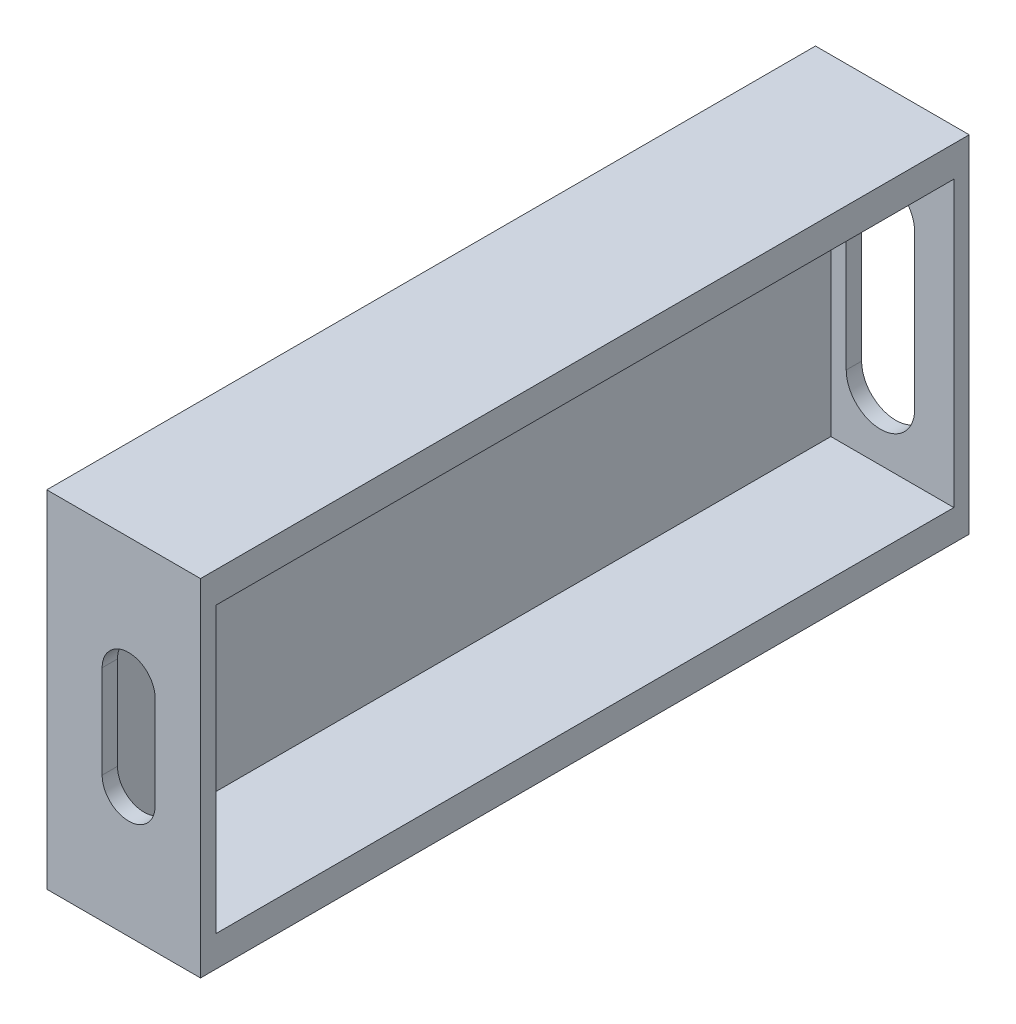
ISO-10303-21;
HEADER;
FILE_DESCRIPTION(('STEP AP214'),'2;1');
FILE_NAME('part.step','',(''),(''),'','','');
FILE_SCHEMA(('AUTOMOTIVE_DESIGN { 1 0 10303 214 1 1 1 1 }'));
ENDSEC;
DATA;
#1=APPLICATION_CONTEXT('core data for automotive mechanical design processes');
#2=APPLICATION_PROTOCOL_DEFINITION('international standard','automotive_design',2000,#1);
#3=PRODUCT_CONTEXT('',#1,'mechanical');
#4=PRODUCT('Part','Part','',(#3));
#5=PRODUCT_RELATED_PRODUCT_CATEGORY('part','',(#4));
#6=PRODUCT_DEFINITION_FORMATION('','',#4);
#7=PRODUCT_DEFINITION_CONTEXT('part definition',#1,'design');
#8=PRODUCT_DEFINITION('design','',#6,#7);
#9=PRODUCT_DEFINITION_SHAPE('','',#8);
#10=(LENGTH_UNIT() NAMED_UNIT(*) SI_UNIT(.MILLI.,.METRE.));
#11=(NAMED_UNIT(*) PLANE_ANGLE_UNIT() SI_UNIT($,.RADIAN.));
#12=(NAMED_UNIT(*) SI_UNIT($,.STERADIAN.) SOLID_ANGLE_UNIT());
#13=UNCERTAINTY_MEASURE_WITH_UNIT(LENGTH_MEASURE(1.E-05),#10,'distance_accuracy_value','');
#14=(GEOMETRIC_REPRESENTATION_CONTEXT(3) GLOBAL_UNCERTAINTY_ASSIGNED_CONTEXT((#13)) GLOBAL_UNIT_ASSIGNED_CONTEXT((#10,
#11,#12)) REPRESENTATION_CONTEXT('',''));
#15=CARTESIAN_POINT('',(0.,0.,0.));
#16=DIRECTION('',(0.,0.,1.));
#17=DIRECTION('',(1.,0.,0.));
#18=AXIS2_PLACEMENT_3D('',#15,#16,#17);
#19=CARTESIAN_POINT('',(10.,0.,0.));
#20=DIRECTION('',(0.,1.,0.));
#21=DIRECTION('',(0.,0.,1.));
#22=AXIS2_PLACEMENT_3D('',#19,#20,#21);
#23=PLANE('',#22);
#24=DIRECTION('',(0.,0.,-1.));
#25=VECTOR('',#24,1.);
#26=CARTESIAN_POINT('',(0.,0.,0.));
#27=LINE('',#26,#25);
#28=CARTESIAN_POINT('',(0.,0.,0.));
#29=VERTEX_POINT('',#28);
#30=CARTESIAN_POINT('',(0.,0.,-50.));
#31=VERTEX_POINT('',#30);
#32=EDGE_CURVE('E241',#29,#31,#27,.T.);
#33=ORIENTED_EDGE('',*,*,#32,.T.);
#34=DIRECTION('',(-1.,0.,0.));
#35=VECTOR('',#34,1.);
#36=CARTESIAN_POINT('',(10.,0.,-50.));
#37=LINE('',#36,#35);
#38=CARTESIAN_POINT('',(10.,0.,-50.));
#39=VERTEX_POINT('',#38);
#40=EDGE_CURVE('E275',#39,#31,#37,.T.);
#41=ORIENTED_EDGE('',*,*,#40,.F.);
#42=DIRECTION('',(0.,0.,-1.));
#43=VECTOR('',#42,1.);
#44=CARTESIAN_POINT('',(10.,0.,0.));
#45=LINE('',#44,#43);
#46=CARTESIAN_POINT('',(10.,0.,0.));
#47=VERTEX_POINT('',#46);
#48=EDGE_CURVE('E247',#47,#39,#45,.T.);
#49=ORIENTED_EDGE('',*,*,#48,.F.);
#50=DIRECTION('',(-1.,0.,0.));
#51=VECTOR('',#50,1.);
#52=CARTESIAN_POINT('',(10.,0.,0.));
#53=LINE('',#52,#51);
#54=EDGE_CURVE('E259',#47,#29,#53,.T.);
#55=ORIENTED_EDGE('',*,*,#54,.T.);
#56=EDGE_LOOP('',(#33,#41,#49,#55));
#57=FACE_BOUND('',#56,.T.);
#58=ADVANCED_FACE('F43',(#57),#23,.F.);
#59=CARTESIAN_POINT('',(10.,0.,-50.));
#60=DIRECTION('',(0.,0.,1.));
#61=DIRECTION('',(1.,0.,0.));
#62=AXIS2_PLACEMENT_3D('',#59,#60,#61);
#63=PLANE('',#62);
#64=DIRECTION('',(0.,-1.,0.));
#65=VECTOR('',#64,1.);
#66=CARTESIAN_POINT('',(7.45,16.25,-50.));
#67=LINE('',#66,#65);
#68=CARTESIAN_POINT('',(7.45,16.25,-50.));
#69=VERTEX_POINT('',#68);
#70=CARTESIAN_POINT('',(7.45,6.25,-50.));
#71=VERTEX_POINT('',#70);
#72=EDGE_CURVE('E209',#69,#71,#67,.T.);
#73=ORIENTED_EDGE('',*,*,#72,.F.);
#74=CARTESIAN_POINT('',(5.225,16.25,-50.));
#75=DIRECTION('',(0.,0.,-1.));
#76=DIRECTION('',(-1.,0.,0.));
#77=AXIS2_PLACEMENT_3D('',#74,#75,#76);
#78=CIRCLE('',#77,2.225);
#79=CARTESIAN_POINT('',(3.,16.25,-50.));
#80=VERTEX_POINT('',#79);
#81=EDGE_CURVE('E206',#80,#69,#78,.T.);
#82=ORIENTED_EDGE('',*,*,#81,.F.);
#83=DIRECTION('',(0.,1.,0.));
#84=VECTOR('',#83,1.);
#85=CARTESIAN_POINT('',(3.,16.25,-50.));
#86=LINE('',#85,#84);
#87=CARTESIAN_POINT('',(3.,6.25,-50.));
#88=VERTEX_POINT('',#87);
#89=EDGE_CURVE('E215',#88,#80,#86,.T.);
#90=ORIENTED_EDGE('',*,*,#89,.F.);
#91=CARTESIAN_POINT('',(5.225,6.25,-50.));
#92=DIRECTION('',(0.,0.,-1.));
#93=DIRECTION('',(-1.,0.,0.));
#94=AXIS2_PLACEMENT_3D('',#91,#92,#93);
#95=CIRCLE('',#94,2.225);
#96=EDGE_CURVE('E212',#71,#88,#95,.T.);
#97=ORIENTED_EDGE('',*,*,#96,.F.);
#98=EDGE_LOOP('',(#73,#82,#90,#97));
#99=FACE_BOUND('',#98,.T.);
#100=DIRECTION('',(0.,1.,0.));
#101=VECTOR('',#100,1.);
#102=CARTESIAN_POINT('',(0.,0.,-50.));
#103=LINE('',#102,#101);
#104=CARTESIAN_POINT('',(0.,22.5,-50.));
#105=VERTEX_POINT('',#104);
#106=EDGE_CURVE('E262',#31,#105,#103,.T.);
#107=ORIENTED_EDGE('',*,*,#106,.T.);
#108=DIRECTION('',(-1.,0.,0.));
#109=VECTOR('',#108,1.);
#110=CARTESIAN_POINT('',(10.,22.5,-50.));
#111=LINE('',#110,#109);
#112=CARTESIAN_POINT('',(10.,22.5,-50.));
#113=VERTEX_POINT('',#112);
#114=EDGE_CURVE('E273',#113,#105,#111,.T.);
#115=ORIENTED_EDGE('',*,*,#114,.F.);
#116=DIRECTION('',(0.,1.,0.));
#117=VECTOR('',#116,1.);
#118=CARTESIAN_POINT('',(10.,0.,-50.));
#119=LINE('',#118,#117);
#120=EDGE_CURVE('E250',#39,#113,#119,.T.);
#121=ORIENTED_EDGE('',*,*,#120,.F.);
#122=ORIENTED_EDGE('',*,*,#40,.T.);
#123=EDGE_LOOP('',(#107,#115,#121,#122));
#124=FACE_BOUND('',#123,.T.);
#125=ADVANCED_FACE('F290',(#99,#124),#63,.F.);
#126=CARTESIAN_POINT('',(10.,22.5,0.));
#127=DIRECTION('',(0.,1.,0.));
#128=DIRECTION('',(0.,0.,1.));
#129=AXIS2_PLACEMENT_3D('',#126,#127,#128);
#130=PLANE('',#129);
#131=DIRECTION('',(0.,0.,-1.));
#132=VECTOR('',#131,1.);
#133=CARTESIAN_POINT('',(0.,22.5,0.));
#134=LINE('',#133,#132);
#135=CARTESIAN_POINT('',(0.,22.5,0.));
#136=VERTEX_POINT('',#135);
#137=EDGE_CURVE('E265',#136,#105,#134,.T.);
#138=ORIENTED_EDGE('',*,*,#137,.F.);
#139=DIRECTION('',(-1.,0.,0.));
#140=VECTOR('',#139,1.);
#141=CARTESIAN_POINT('',(10.,22.5,0.));
#142=LINE('',#141,#140);
#143=CARTESIAN_POINT('',(10.,22.5,0.));
#144=VERTEX_POINT('',#143);
#145=EDGE_CURVE('E271',#144,#136,#142,.T.);
#146=ORIENTED_EDGE('',*,*,#145,.F.);
#147=DIRECTION('',(0.,0.,-1.));
#148=VECTOR('',#147,1.);
#149=CARTESIAN_POINT('',(10.,22.5,0.));
#150=LINE('',#149,#148);
#151=EDGE_CURVE('E253',#144,#113,#150,.T.);
#152=ORIENTED_EDGE('',*,*,#151,.T.);
#153=ORIENTED_EDGE('',*,*,#114,.T.);
#154=EDGE_LOOP('',(#138,#146,#152,#153));
#155=FACE_BOUND('',#154,.T.);
#156=ADVANCED_FACE('F313',(#155),#130,.T.);
#157=CARTESIAN_POINT('',(10.,0.,0.));
#158=DIRECTION('',(0.,0.,1.));
#159=DIRECTION('',(1.,0.,0.));
#160=AXIS2_PLACEMENT_3D('',#157,#158,#159);
#161=PLANE('',#160);
#162=CARTESIAN_POINT('',(5.325,14.275,0.));
#163=DIRECTION('',(0.,0.,1.));
#164=DIRECTION('',(1.,0.,0.));
#165=AXIS2_PLACEMENT_3D('',#162,#163,#164);
#166=CIRCLE('',#165,1.725);
#167=CARTESIAN_POINT('',(7.05,14.275,0.));
#168=VERTEX_POINT('',#167);
#169=CARTESIAN_POINT('',(3.6,14.275,0.));
#170=VERTEX_POINT('',#169);
#171=EDGE_CURVE('E221',#168,#170,#166,.T.);
#172=ORIENTED_EDGE('',*,*,#171,.F.);
#173=DIRECTION('',(0.,1.,0.));
#174=VECTOR('',#173,1.);
#175=CARTESIAN_POINT('',(7.05,14.275,0.));
#176=LINE('',#175,#174);
#177=CARTESIAN_POINT('',(7.05,8.225,0.));
#178=VERTEX_POINT('',#177);
#179=EDGE_CURVE('E235',#178,#168,#176,.T.);
#180=ORIENTED_EDGE('',*,*,#179,.F.);
#181=CARTESIAN_POINT('',(5.325,8.225,0.));
#182=DIRECTION('',(0.,0.,1.));
#183=DIRECTION('',(1.,0.,0.));
#184=AXIS2_PLACEMENT_3D('',#181,#182,#183);
#185=CIRCLE('',#184,1.725);
#186=CARTESIAN_POINT('',(3.6,8.225,0.));
#187=VERTEX_POINT('',#186);
#188=EDGE_CURVE('E232',#187,#178,#185,.T.);
#189=ORIENTED_EDGE('',*,*,#188,.F.);
#190=DIRECTION('',(0.,-1.,0.));
#191=VECTOR('',#190,1.);
#192=CARTESIAN_POINT('',(3.6,14.275,0.));
#193=LINE('',#192,#191);
#194=EDGE_CURVE('E229',#170,#187,#193,.T.);
#195=ORIENTED_EDGE('',*,*,#194,.F.);
#196=EDGE_LOOP('',(#172,#180,#189,#195));
#197=FACE_BOUND('',#196,.T.);
#198=DIRECTION('',(0.,1.,0.));
#199=VECTOR('',#198,1.);
#200=CARTESIAN_POINT('',(0.,0.,0.));
#201=LINE('',#200,#199);
#202=EDGE_CURVE('E251',#29,#136,#201,.T.);
#203=ORIENTED_EDGE('',*,*,#202,.F.);
#204=ORIENTED_EDGE('',*,*,#54,.F.);
#205=DIRECTION('',(0.,1.,0.));
#206=VECTOR('',#205,1.);
#207=CARTESIAN_POINT('',(10.,0.,0.));
#208=LINE('',#207,#206);
#209=EDGE_CURVE('E256',#47,#144,#208,.T.);
#210=ORIENTED_EDGE('',*,*,#209,.T.);
#211=ORIENTED_EDGE('',*,*,#145,.T.);
#212=EDGE_LOOP('',(#203,#204,#210,#211));
#213=FACE_BOUND('',#212,.T.);
#214=ADVANCED_FACE('F321',(#197,#213),#161,.T.);
#215=CARTESIAN_POINT('',(10.,0.,0.));
#216=DIRECTION('',(1.,0.,0.));
#217=DIRECTION('',(0.,0.,-1.));
#218=AXIS2_PLACEMENT_3D('',#215,#216,#217);
#219=PLANE('',#218);
#220=DIRECTION('',(0.,-1.,0.));
#221=VECTOR('',#220,1.);
#222=CARTESIAN_POINT('',(10.,20.5,-1.));
#223=LINE('',#222,#221);
#224=CARTESIAN_POINT('',(10.,20.5,-1.));
#225=VERTEX_POINT('',#224);
#226=CARTESIAN_POINT('',(10.,2.,-1.));
#227=VERTEX_POINT('',#226);
#228=EDGE_CURVE('E57',#225,#227,#223,.T.);
#229=ORIENTED_EDGE('',*,*,#228,.F.);
#230=DIRECTION('',(0.,0.,1.));
#231=VECTOR('',#230,1.);
#232=CARTESIAN_POINT('',(10.,20.5,-1.));
#233=LINE('',#232,#231);
#234=CARTESIAN_POINT('',(10.,20.5,-49.));
#235=VERTEX_POINT('',#234);
#236=EDGE_CURVE('E178',#235,#225,#233,.T.);
#237=ORIENTED_EDGE('',*,*,#236,.F.);
#238=DIRECTION('',(0.,1.,0.));
#239=VECTOR('',#238,1.);
#240=CARTESIAN_POINT('',(10.,20.5,-49.));
#241=LINE('',#240,#239);
#242=CARTESIAN_POINT('',(10.,2.,-49.));
#243=VERTEX_POINT('',#242);
#244=EDGE_CURVE('E161',#243,#235,#241,.T.);
#245=ORIENTED_EDGE('',*,*,#244,.F.);
#246=DIRECTION('',(0.,0.,-1.));
#247=VECTOR('',#246,1.);
#248=CARTESIAN_POINT('',(10.,2.,-1.));
#249=LINE('',#248,#247);
#250=EDGE_CURVE('E171',#227,#243,#249,.T.);
#251=ORIENTED_EDGE('',*,*,#250,.F.);
#252=EDGE_LOOP('',(#229,#237,#245,#251));
#253=FACE_BOUND('',#252,.T.);
#254=ORIENTED_EDGE('',*,*,#48,.T.);
#255=ORIENTED_EDGE('',*,*,#120,.T.);
#256=ORIENTED_EDGE('',*,*,#151,.F.);
#257=ORIENTED_EDGE('',*,*,#209,.F.);
#258=EDGE_LOOP('',(#254,#255,#256,#257));
#259=FACE_BOUND('',#258,.T.);
#260=ADVANCED_FACE('F175',(#253,#259),#219,.T.);
#261=CARTESIAN_POINT('',(0.,0.,0.));
#262=DIRECTION('',(1.,0.,0.));
#263=DIRECTION('',(0.,0.,-1.));
#264=AXIS2_PLACEMENT_3D('',#261,#262,#263);
#265=PLANE('',#264);
#266=ORIENTED_EDGE('',*,*,#32,.F.);
#267=ORIENTED_EDGE('',*,*,#202,.T.);
#268=ORIENTED_EDGE('',*,*,#137,.T.);
#269=ORIENTED_EDGE('',*,*,#106,.F.);
#270=EDGE_LOOP('',(#266,#267,#268,#269));
#271=FACE_BOUND('',#270,.T.);
#272=ADVANCED_FACE('F319',(#271),#265,.F.);
#273=CARTESIAN_POINT('',(5.325,14.275,-10.));
#274=DIRECTION('',(0.,0.,1.));
#275=DIRECTION('',(1.,0.,0.));
#276=AXIS2_PLACEMENT_3D('',#273,#274,#275);
#277=CYLINDRICAL_SURFACE('',#276,1.725);
#278=DIRECTION('',(0.,0.,1.));
#279=VECTOR('',#278,1.);
#280=CARTESIAN_POINT('',(3.6,14.275,-10.));
#281=LINE('',#280,#279);
#282=CARTESIAN_POINT('',(3.6,14.275,-0.999999999999999));
#283=VERTEX_POINT('',#282);
#284=EDGE_CURVE('E238',#283,#170,#281,.T.);
#285=ORIENTED_EDGE('',*,*,#284,.F.);
#286=CARTESIAN_POINT('',(5.325,14.275,-0.999999999999999));
#287=DIRECTION('',(0.,0.,1.));
#288=DIRECTION('',(0.,-1.,0.));
#289=AXIS2_PLACEMENT_3D('',#286,#287,#288);
#290=CIRCLE('',#289,1.725);
#291=CARTESIAN_POINT('',(7.05,14.275,-0.999999999999999));
#292=VERTEX_POINT('',#291);
#293=EDGE_CURVE('E65',#283,#292,#290,.F.);
#294=ORIENTED_EDGE('',*,*,#293,.T.);
#295=DIRECTION('',(0.,0.,1.));
#296=VECTOR('',#295,1.);
#297=CARTESIAN_POINT('',(7.05,14.275,-10.));
#298=LINE('',#297,#296);
#299=EDGE_CURVE('E239',#292,#168,#298,.T.);
#300=ORIENTED_EDGE('',*,*,#299,.T.);
#301=ORIENTED_EDGE('',*,*,#171,.T.);
#302=EDGE_LOOP('',(#285,#294,#300,#301));
#303=FACE_BOUND('',#302,.T.);
#304=ADVANCED_FACE('F333',(#303),#277,.F.);
#305=CARTESIAN_POINT('',(7.05,14.275,-10.));
#306=DIRECTION('',(1.,0.,0.));
#307=DIRECTION('',(0.,0.,-1.));
#308=AXIS2_PLACEMENT_3D('',#305,#306,#307);
#309=PLANE('',#308);
#310=ORIENTED_EDGE('',*,*,#299,.F.);
#311=DIRECTION('',(0.,-1.,0.));
#312=VECTOR('',#311,1.);
#313=CARTESIAN_POINT('',(7.05,14.275,-0.999999999999999));
#314=LINE('',#313,#312);
#315=CARTESIAN_POINT('',(7.05,8.225,-1.));
#316=VERTEX_POINT('',#315);
#317=EDGE_CURVE('E202',#292,#316,#314,.T.);
#318=ORIENTED_EDGE('',*,*,#317,.T.);
#319=DIRECTION('',(0.,0.,1.));
#320=VECTOR('',#319,1.);
#321=CARTESIAN_POINT('',(7.05,8.225,-10.));
#322=LINE('',#321,#320);
#323=EDGE_CURVE('E242',#316,#178,#322,.T.);
#324=ORIENTED_EDGE('',*,*,#323,.T.);
#325=ORIENTED_EDGE('',*,*,#179,.T.);
#326=EDGE_LOOP('',(#310,#318,#324,#325));
#327=FACE_BOUND('',#326,.T.);
#328=ADVANCED_FACE('F377',(#327),#309,.F.);
#329=CARTESIAN_POINT('',(5.325,8.225,-10.));
#330=DIRECTION('',(0.,0.,1.));
#331=DIRECTION('',(1.,0.,0.));
#332=AXIS2_PLACEMENT_3D('',#329,#330,#331);
#333=CYLINDRICAL_SURFACE('',#332,1.725);
#334=ORIENTED_EDGE('',*,*,#323,.F.);
#335=CARTESIAN_POINT('',(5.325,8.225,-1.));
#336=DIRECTION('',(0.,0.,1.));
#337=DIRECTION('',(0.,-1.,0.));
#338=AXIS2_PLACEMENT_3D('',#335,#336,#337);
#339=CIRCLE('',#338,1.725);
#340=CARTESIAN_POINT('',(3.6,8.225,-1.));
#341=VERTEX_POINT('',#340);
#342=EDGE_CURVE('E199',#316,#341,#339,.F.);
#343=ORIENTED_EDGE('',*,*,#342,.T.);
#344=DIRECTION('',(0.,0.,1.));
#345=VECTOR('',#344,1.);
#346=CARTESIAN_POINT('',(3.6,8.225,-10.));
#347=LINE('',#346,#345);
#348=EDGE_CURVE('E244',#341,#187,#347,.T.);
#349=ORIENTED_EDGE('',*,*,#348,.T.);
#350=ORIENTED_EDGE('',*,*,#188,.T.);
#351=EDGE_LOOP('',(#334,#343,#349,#350));
#352=FACE_BOUND('',#351,.T.);
#353=ADVANCED_FACE('F385',(#352),#333,.F.);
#354=CARTESIAN_POINT('',(3.6,14.275,-10.));
#355=DIRECTION('',(-1.,0.,0.));
#356=DIRECTION('',(0.,0.,1.));
#357=AXIS2_PLACEMENT_3D('',#354,#355,#356);
#358=PLANE('',#357);
#359=ORIENTED_EDGE('',*,*,#348,.F.);
#360=DIRECTION('',(0.,1.,0.));
#361=VECTOR('',#360,1.);
#362=CARTESIAN_POINT('',(3.6,14.275,-0.999999999999999));
#363=LINE('',#362,#361);
#364=EDGE_CURVE('E12',#341,#283,#363,.T.);
#365=ORIENTED_EDGE('',*,*,#364,.T.);
#366=ORIENTED_EDGE('',*,*,#284,.T.);
#367=ORIENTED_EDGE('',*,*,#194,.T.);
#368=EDGE_LOOP('',(#359,#365,#366,#367));
#369=FACE_BOUND('',#368,.T.);
#370=ADVANCED_FACE('F304',(#369),#358,.F.);
#371=CARTESIAN_POINT('',(5.225,16.25,-40.));
#372=DIRECTION('',(0.,0.,-1.));
#373=DIRECTION('',(-1.,0.,0.));
#374=AXIS2_PLACEMENT_3D('',#371,#372,#373);
#375=CYLINDRICAL_SURFACE('',#374,2.225);
#376=DIRECTION('',(0.,0.,-1.));
#377=VECTOR('',#376,1.);
#378=CARTESIAN_POINT('',(7.45,16.25,-40.));
#379=LINE('',#378,#377);
#380=CARTESIAN_POINT('',(7.45,16.25,-49.));
#381=VERTEX_POINT('',#380);
#382=EDGE_CURVE('E218',#381,#69,#379,.T.);
#383=ORIENTED_EDGE('',*,*,#382,.F.);
#384=CARTESIAN_POINT('',(5.225,16.25,-49.));
#385=DIRECTION('',(0.,0.,-1.));
#386=DIRECTION('',(-1.,0.,0.));
#387=AXIS2_PLACEMENT_3D('',#384,#385,#386);
#388=CIRCLE('',#387,2.225);
#389=CARTESIAN_POINT('',(3.,16.25,-49.));
#390=VERTEX_POINT('',#389);
#391=EDGE_CURVE('E196',#381,#390,#388,.F.);
#392=ORIENTED_EDGE('',*,*,#391,.T.);
#393=DIRECTION('',(0.,0.,-1.));
#394=VECTOR('',#393,1.);
#395=CARTESIAN_POINT('',(3.,16.25,-40.));
#396=LINE('',#395,#394);
#397=EDGE_CURVE('E219',#390,#80,#396,.T.);
#398=ORIENTED_EDGE('',*,*,#397,.T.);
#399=ORIENTED_EDGE('',*,*,#81,.T.);
#400=EDGE_LOOP('',(#383,#392,#398,#399));
#401=FACE_BOUND('',#400,.T.);
#402=ADVANCED_FACE('F283',(#401),#375,.F.);
#403=CARTESIAN_POINT('',(3.,16.25,-40.));
#404=DIRECTION('',(-1.,0.,0.));
#405=DIRECTION('',(0.,0.,1.));
#406=AXIS2_PLACEMENT_3D('',#403,#404,#405);
#407=PLANE('',#406);
#408=ORIENTED_EDGE('',*,*,#397,.F.);
#409=DIRECTION('',(0.,-1.,0.));
#410=VECTOR('',#409,1.);
#411=CARTESIAN_POINT('',(3.,16.25,-49.));
#412=LINE('',#411,#410);
#413=CARTESIAN_POINT('',(3.,6.25,-49.));
#414=VERTEX_POINT('',#413);
#415=EDGE_CURVE('E193',#390,#414,#412,.T.);
#416=ORIENTED_EDGE('',*,*,#415,.T.);
#417=DIRECTION('',(0.,0.,-1.));
#418=VECTOR('',#417,1.);
#419=CARTESIAN_POINT('',(3.,6.25,-40.));
#420=LINE('',#419,#418);
#421=EDGE_CURVE('E222',#414,#88,#420,.T.);
#422=ORIENTED_EDGE('',*,*,#421,.T.);
#423=ORIENTED_EDGE('',*,*,#89,.T.);
#424=EDGE_LOOP('',(#408,#416,#422,#423));
#425=FACE_BOUND('',#424,.T.);
#426=ADVANCED_FACE('F296',(#425),#407,.F.);
#427=CARTESIAN_POINT('',(5.225,6.25,-40.));
#428=DIRECTION('',(0.,0.,-1.));
#429=DIRECTION('',(-1.,0.,0.));
#430=AXIS2_PLACEMENT_3D('',#427,#428,#429);
#431=CYLINDRICAL_SURFACE('',#430,2.225);
#432=ORIENTED_EDGE('',*,*,#421,.F.);
#433=CARTESIAN_POINT('',(5.225,6.25,-49.));
#434=DIRECTION('',(0.,0.,-1.));
#435=DIRECTION('',(-1.,0.,0.));
#436=AXIS2_PLACEMENT_3D('',#433,#434,#435);
#437=CIRCLE('',#436,2.225);
#438=CARTESIAN_POINT('',(7.45,6.25,-49.));
#439=VERTEX_POINT('',#438);
#440=EDGE_CURVE('E189',#414,#439,#437,.F.);
#441=ORIENTED_EDGE('',*,*,#440,.T.);
#442=DIRECTION('',(0.,0.,-1.));
#443=VECTOR('',#442,1.);
#444=CARTESIAN_POINT('',(7.45,6.25,-40.));
#445=LINE('',#444,#443);
#446=EDGE_CURVE('E224',#439,#71,#445,.T.);
#447=ORIENTED_EDGE('',*,*,#446,.T.);
#448=ORIENTED_EDGE('',*,*,#96,.T.);
#449=EDGE_LOOP('',(#432,#441,#447,#448));
#450=FACE_BOUND('',#449,.T.);
#451=ADVANCED_FACE('F294',(#450),#431,.F.);
#452=CARTESIAN_POINT('',(7.45,16.25,-40.));
#453=DIRECTION('',(1.,0.,0.));
#454=DIRECTION('',(0.,0.,-1.));
#455=AXIS2_PLACEMENT_3D('',#452,#453,#454);
#456=PLANE('',#455);
#457=ORIENTED_EDGE('',*,*,#446,.F.);
#458=DIRECTION('',(0.,1.,0.));
#459=VECTOR('',#458,1.);
#460=CARTESIAN_POINT('',(7.45,16.25,-49.));
#461=LINE('',#460,#459);
#462=EDGE_CURVE('E50',#439,#381,#461,.T.);
#463=ORIENTED_EDGE('',*,*,#462,.T.);
#464=ORIENTED_EDGE('',*,*,#382,.T.);
#465=ORIENTED_EDGE('',*,*,#72,.T.);
#466=EDGE_LOOP('',(#457,#463,#464,#465));
#467=FACE_BOUND('',#466,.T.);
#468=ADVANCED_FACE('F281',(#467),#456,.F.);
#469=CARTESIAN_POINT('',(-51.4417145903983,20.5,-1.));
#470=DIRECTION('',(0.,0.,1.));
#471=DIRECTION('',(0.,-1.,0.));
#472=AXIS2_PLACEMENT_3D('',#469,#470,#471);
#473=PLANE('',#472);
#474=DIRECTION('',(0.,1.,0.));
#475=VECTOR('',#474,1.);
#476=CARTESIAN_POINT('',(2.,20.5,-1.));
#477=LINE('',#476,#475);
#478=CARTESIAN_POINT('',(2.,2.,-1.));
#479=VERTEX_POINT('',#478);
#480=CARTESIAN_POINT('',(2.,20.5,-1.));
#481=VERTEX_POINT('',#480);
#482=EDGE_CURVE('E190',#479,#481,#477,.T.);
#483=ORIENTED_EDGE('',*,*,#482,.T.);
#484=DIRECTION('',(1.,0.,0.));
#485=VECTOR('',#484,1.);
#486=CARTESIAN_POINT('',(-51.4417145903983,20.5,-1.));
#487=LINE('',#486,#485);
#488=EDGE_CURVE('E183',#481,#225,#487,.T.);
#489=ORIENTED_EDGE('',*,*,#488,.T.);
#490=ORIENTED_EDGE('',*,*,#228,.T.);
#491=DIRECTION('',(1.,0.,0.));
#492=VECTOR('',#491,1.);
#493=CARTESIAN_POINT('',(-51.4417145903983,2.,-1.));
#494=LINE('',#493,#492);
#495=EDGE_CURVE('E168',#479,#227,#494,.T.);
#496=ORIENTED_EDGE('',*,*,#495,.F.);
#497=EDGE_LOOP('',(#483,#489,#490,#496));
#498=FACE_BOUND('',#497,.T.);
#499=ORIENTED_EDGE('',*,*,#364,.F.);
#500=ORIENTED_EDGE('',*,*,#342,.F.);
#501=ORIENTED_EDGE('',*,*,#317,.F.);
#502=ORIENTED_EDGE('',*,*,#293,.F.);
#503=EDGE_LOOP('',(#499,#500,#501,#502));
#504=FACE_BOUND('',#503,.T.);
#505=ADVANCED_FACE('F423',(#498,#504),#473,.F.);
#506=CARTESIAN_POINT('',(-51.4417145903983,20.5,-49.));
#507=DIRECTION('',(0.,0.,-1.));
#508=DIRECTION('',(-1.,0.,0.));
#509=AXIS2_PLACEMENT_3D('',#506,#507,#508);
#510=PLANE('',#509);
#511=DIRECTION('',(0.,-1.,0.));
#512=VECTOR('',#511,1.);
#513=CARTESIAN_POINT('',(2.,20.5,-49.));
#514=LINE('',#513,#512);
#515=CARTESIAN_POINT('',(2.,20.5,-49.));
#516=VERTEX_POINT('',#515);
#517=CARTESIAN_POINT('',(2.,2.,-49.));
#518=VERTEX_POINT('',#517);
#519=EDGE_CURVE('E164',#516,#518,#514,.T.);
#520=ORIENTED_EDGE('',*,*,#519,.T.);
#521=DIRECTION('',(1.,0.,0.));
#522=VECTOR('',#521,1.);
#523=CARTESIAN_POINT('',(-51.4417145903983,2.,-49.));
#524=LINE('',#523,#522);
#525=EDGE_CURVE('E155',#518,#243,#524,.T.);
#526=ORIENTED_EDGE('',*,*,#525,.T.);
#527=ORIENTED_EDGE('',*,*,#244,.T.);
#528=DIRECTION('',(1.,0.,0.));
#529=VECTOR('',#528,1.);
#530=CARTESIAN_POINT('',(-51.4417145903983,20.5,-49.));
#531=LINE('',#530,#529);
#532=EDGE_CURVE('E167',#516,#235,#531,.T.);
#533=ORIENTED_EDGE('',*,*,#532,.F.);
#534=EDGE_LOOP('',(#520,#526,#527,#533));
#535=FACE_BOUND('',#534,.T.);
#536=ORIENTED_EDGE('',*,*,#462,.F.);
#537=ORIENTED_EDGE('',*,*,#440,.F.);
#538=ORIENTED_EDGE('',*,*,#415,.F.);
#539=ORIENTED_EDGE('',*,*,#391,.F.);
#540=EDGE_LOOP('',(#536,#537,#538,#539));
#541=FACE_BOUND('',#540,.T.);
#542=ADVANCED_FACE('F157',(#535,#541),#510,.F.);
#543=CARTESIAN_POINT('',(-51.4417145903983,20.5,-1.));
#544=DIRECTION('',(0.,1.,0.));
#545=DIRECTION('',(0.,0.,1.));
#546=AXIS2_PLACEMENT_3D('',#543,#544,#545);
#547=PLANE('',#546);
#548=DIRECTION('',(0.,0.,-1.));
#549=VECTOR('',#548,1.);
#550=CARTESIAN_POINT('',(2.,20.5,-1.));
#551=LINE('',#550,#549);
#552=EDGE_CURVE('E473',#481,#516,#551,.T.);
#553=ORIENTED_EDGE('',*,*,#552,.T.);
#554=ORIENTED_EDGE('',*,*,#532,.T.);
#555=ORIENTED_EDGE('',*,*,#236,.T.);
#556=ORIENTED_EDGE('',*,*,#488,.F.);
#557=EDGE_LOOP('',(#553,#554,#555,#556));
#558=FACE_BOUND('',#557,.T.);
#559=ADVANCED_FACE('F437',(#558),#547,.F.);
#560=CARTESIAN_POINT('',(-51.4417145903983,2.,-1.));
#561=DIRECTION('',(0.,-1.,0.));
#562=DIRECTION('',(0.,0.,-1.));
#563=AXIS2_PLACEMENT_3D('',#560,#561,#562);
#564=PLANE('',#563);
#565=DIRECTION('',(0.,0.,1.));
#566=VECTOR('',#565,1.);
#567=CARTESIAN_POINT('',(2.,2.,-1.));
#568=LINE('',#567,#566);
#569=EDGE_CURVE('E187',#518,#479,#568,.T.);
#570=ORIENTED_EDGE('',*,*,#569,.T.);
#571=ORIENTED_EDGE('',*,*,#495,.T.);
#572=ORIENTED_EDGE('',*,*,#250,.T.);
#573=ORIENTED_EDGE('',*,*,#525,.F.);
#574=EDGE_LOOP('',(#570,#571,#572,#573));
#575=FACE_BOUND('',#574,.T.);
#576=ADVANCED_FACE('F172',(#575),#564,.F.);
#577=CARTESIAN_POINT('',(2.,0.,0.));
#578=DIRECTION('',(1.,0.,0.));
#579=DIRECTION('',(0.,0.,-1.));
#580=AXIS2_PLACEMENT_3D('',#577,#578,#579);
#581=PLANE('',#580);
#582=ORIENTED_EDGE('',*,*,#482,.F.);
#583=ORIENTED_EDGE('',*,*,#569,.F.);
#584=ORIENTED_EDGE('',*,*,#519,.F.);
#585=ORIENTED_EDGE('',*,*,#552,.F.);
#586=EDGE_LOOP('',(#582,#583,#584,#585));
#587=FACE_BOUND('',#586,.T.);
#588=ADVANCED_FACE('F453',(#587),#581,.T.);
#589=CLOSED_SHELL('',(#58,#125,#156,#214,#260,#272,#304,#328,#353,#370,#402,#426,#451,#468,#505,
#542,#559,#576,#588));
#590=MANIFOLD_SOLID_BREP('B2',#589);
#591=ADVANCED_BREP_SHAPE_REPRESENTATION('',(#18,#590),#14);
#592=SHAPE_DEFINITION_REPRESENTATION(#9,#591);
ENDSEC;
END-ISO-10303-21;
